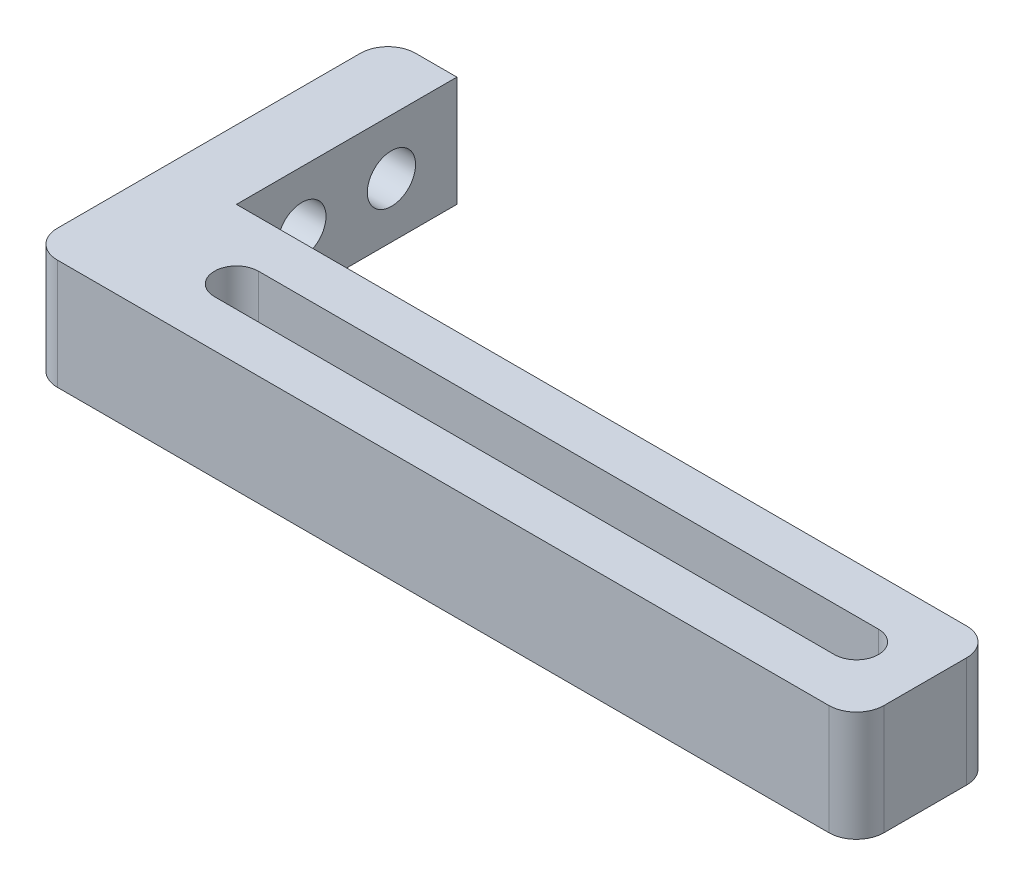
ISO-10303-21;
HEADER;
FILE_DESCRIPTION(('STEP AP214'),'2;1');
FILE_NAME('part.step','',(''),(''),'','','');
FILE_SCHEMA(('AUTOMOTIVE_DESIGN { 1 0 10303 214 1 1 1 1 }'));
ENDSEC;
DATA;
#1=APPLICATION_CONTEXT('core data for automotive mechanical design processes');
#2=APPLICATION_PROTOCOL_DEFINITION('international standard','automotive_design',2000,#1);
#3=PRODUCT_CONTEXT('',#1,'mechanical');
#4=PRODUCT('Part','Part','',(#3));
#5=PRODUCT_RELATED_PRODUCT_CATEGORY('part','',(#4));
#6=PRODUCT_DEFINITION_FORMATION('','',#4);
#7=PRODUCT_DEFINITION_CONTEXT('part definition',#1,'design');
#8=PRODUCT_DEFINITION('design','',#6,#7);
#9=PRODUCT_DEFINITION_SHAPE('','',#8);
#10=(LENGTH_UNIT() NAMED_UNIT(*) SI_UNIT(.MILLI.,.METRE.));
#11=(NAMED_UNIT(*) PLANE_ANGLE_UNIT() SI_UNIT($,.RADIAN.));
#12=(NAMED_UNIT(*) SI_UNIT($,.STERADIAN.) SOLID_ANGLE_UNIT());
#13=UNCERTAINTY_MEASURE_WITH_UNIT(LENGTH_MEASURE(1.E-05),#10,'distance_accuracy_value','');
#14=(GEOMETRIC_REPRESENTATION_CONTEXT(3) GLOBAL_UNCERTAINTY_ASSIGNED_CONTEXT((#13)) GLOBAL_UNIT_ASSIGNED_CONTEXT((#10,
#11,#12)) REPRESENTATION_CONTEXT('',''));
#15=CARTESIAN_POINT('',(0.,0.,0.));
#16=DIRECTION('',(0.,0.,1.));
#17=DIRECTION('',(1.,0.,0.));
#18=AXIS2_PLACEMENT_3D('',#15,#16,#17);
#19=CARTESIAN_POINT('',(10.,0.,-5.));
#20=DIRECTION('',(0.,1.,0.));
#21=DIRECTION('',(0.,0.,1.));
#22=AXIS2_PLACEMENT_3D('',#19,#20,#21);
#23=CYLINDRICAL_SURFACE('',#22,1.6);
#24=CARTESIAN_POINT('',(10.,3.,-5.));
#25=DIRECTION('',(0.,-1.,0.));
#26=DIRECTION('',(0.,0.,-1.));
#27=AXIS2_PLACEMENT_3D('',#24,#25,#26);
#28=CIRCLE('',#27,1.6);
#29=CARTESIAN_POINT('',(10.,3.,-6.6));
#30=VERTEX_POINT('',#29);
#31=CARTESIAN_POINT('',(10.,3.,-3.4));
#32=VERTEX_POINT('',#31);
#33=EDGE_CURVE('E207',#30,#32,#28,.F.);
#34=ORIENTED_EDGE('',*,*,#33,.F.);
#35=DIRECTION('',(0.,1.,0.));
#36=VECTOR('',#35,1.);
#37=CARTESIAN_POINT('',(10.,0.,-6.6));
#38=LINE('',#37,#36);
#39=CARTESIAN_POINT('',(10.,8.,-6.6));
#40=VERTEX_POINT('',#39);
#41=EDGE_CURVE('E222',#30,#40,#38,.T.);
#42=ORIENTED_EDGE('',*,*,#41,.T.);
#43=CARTESIAN_POINT('',(10.,8.,-5.));
#44=DIRECTION('',(0.,1.,0.));
#45=DIRECTION('',(0.,0.,1.));
#46=AXIS2_PLACEMENT_3D('',#43,#44,#45);
#47=CIRCLE('',#46,1.6);
#48=CARTESIAN_POINT('',(10.,8.,-3.4));
#49=VERTEX_POINT('',#48);
#50=EDGE_CURVE('E209',#40,#49,#47,.T.);
#51=ORIENTED_EDGE('',*,*,#50,.T.);
#52=DIRECTION('',(0.,1.,0.));
#53=VECTOR('',#52,1.);
#54=CARTESIAN_POINT('',(10.,0.,-3.4));
#55=LINE('',#54,#53);
#56=EDGE_CURVE('E221',#32,#49,#55,.T.);
#57=ORIENTED_EDGE('',*,*,#56,.F.);
#58=EDGE_LOOP('',(#34,#42,#51,#57));
#59=FACE_BOUND('',#58,.T.);
#60=ADVANCED_FACE('F33',(#59),#23,.F.);
#61=CARTESIAN_POINT('',(10.,0.,-6.6));
#62=DIRECTION('',(0.,0.,-1.));
#63=DIRECTION('',(-1.,0.,0.));
#64=AXIS2_PLACEMENT_3D('',#61,#62,#63);
#65=PLANE('',#64);
#66=DIRECTION('',(-1.,0.,0.));
#67=VECTOR('',#66,1.);
#68=CARTESIAN_POINT('',(10.,3.,-6.6));
#69=LINE('',#68,#67);
#70=CARTESIAN_POINT('',(55.,3.,-6.6));
#71=VERTEX_POINT('',#70);
#72=EDGE_CURVE('E205',#71,#30,#69,.T.);
#73=ORIENTED_EDGE('',*,*,#72,.F.);
#74=DIRECTION('',(0.,1.,0.));
#75=VECTOR('',#74,1.);
#76=CARTESIAN_POINT('',(55.,0.,-6.6));
#77=LINE('',#76,#75);
#78=CARTESIAN_POINT('',(55.,8.,-6.6));
#79=VERTEX_POINT('',#78);
#80=EDGE_CURVE('E225',#71,#79,#77,.T.);
#81=ORIENTED_EDGE('',*,*,#80,.T.);
#82=DIRECTION('',(-1.,0.,0.));
#83=VECTOR('',#82,1.);
#84=CARTESIAN_POINT('',(10.,8.,-6.6));
#85=LINE('',#84,#83);
#86=EDGE_CURVE('E218',#79,#40,#85,.T.);
#87=ORIENTED_EDGE('',*,*,#86,.T.);
#88=ORIENTED_EDGE('',*,*,#41,.F.);
#89=EDGE_LOOP('',(#73,#81,#87,#88));
#90=FACE_BOUND('',#89,.T.);
#91=ADVANCED_FACE('F357',(#90),#65,.F.);
#92=CARTESIAN_POINT('',(55.,0.,-5.));
#93=DIRECTION('',(0.,1.,0.));
#94=DIRECTION('',(0.,0.,1.));
#95=AXIS2_PLACEMENT_3D('',#92,#93,#94);
#96=CYLINDRICAL_SURFACE('',#95,1.6);
#97=CARTESIAN_POINT('',(55.,3.,-5.));
#98=DIRECTION('',(0.,-1.,0.));
#99=DIRECTION('',(0.,0.,-1.));
#100=AXIS2_PLACEMENT_3D('',#97,#98,#99);
#101=CIRCLE('',#100,1.6);
#102=CARTESIAN_POINT('',(55.,3.,-3.4));
#103=VERTEX_POINT('',#102);
#104=EDGE_CURVE('E200',#103,#71,#101,.F.);
#105=ORIENTED_EDGE('',*,*,#104,.F.);
#106=DIRECTION('',(0.,1.,0.));
#107=VECTOR('',#106,1.);
#108=CARTESIAN_POINT('',(55.,0.,-3.4));
#109=LINE('',#108,#107);
#110=CARTESIAN_POINT('',(55.,8.,-3.4));
#111=VERTEX_POINT('',#110);
#112=EDGE_CURVE('E227',#103,#111,#109,.T.);
#113=ORIENTED_EDGE('',*,*,#112,.T.);
#114=CARTESIAN_POINT('',(55.,8.,-5.));
#115=DIRECTION('',(0.,1.,0.));
#116=DIRECTION('',(0.,0.,1.));
#117=AXIS2_PLACEMENT_3D('',#114,#115,#116);
#118=CIRCLE('',#117,1.6);
#119=EDGE_CURVE('E215',#111,#79,#118,.T.);
#120=ORIENTED_EDGE('',*,*,#119,.T.);
#121=ORIENTED_EDGE('',*,*,#80,.F.);
#122=EDGE_LOOP('',(#105,#113,#120,#121));
#123=FACE_BOUND('',#122,.T.);
#124=ADVANCED_FACE('F363',(#123),#96,.F.);
#125=CARTESIAN_POINT('',(10.,0.,-3.4));
#126=DIRECTION('',(0.,0.,1.));
#127=DIRECTION('',(1.,0.,0.));
#128=AXIS2_PLACEMENT_3D('',#125,#126,#127);
#129=PLANE('',#128);
#130=DIRECTION('',(1.,0.,0.));
#131=VECTOR('',#130,1.);
#132=CARTESIAN_POINT('',(10.,3.,-3.4));
#133=LINE('',#132,#131);
#134=EDGE_CURVE('E277',#32,#103,#133,.T.);
#135=ORIENTED_EDGE('',*,*,#134,.F.);
#136=ORIENTED_EDGE('',*,*,#56,.T.);
#137=DIRECTION('',(1.,0.,0.));
#138=VECTOR('',#137,1.);
#139=CARTESIAN_POINT('',(10.,8.,-3.4));
#140=LINE('',#139,#138);
#141=EDGE_CURVE('E212',#49,#111,#140,.T.);
#142=ORIENTED_EDGE('',*,*,#141,.T.);
#143=ORIENTED_EDGE('',*,*,#112,.F.);
#144=EDGE_LOOP('',(#135,#136,#142,#143));
#145=FACE_BOUND('',#144,.T.);
#146=ADVANCED_FACE('F369',(#145),#129,.F.);
#147=CARTESIAN_POINT('',(5.,8.,-26.));
#148=DIRECTION('',(0.,0.,1.));
#149=DIRECTION('',(1.,0.,0.));
#150=AXIS2_PLACEMENT_3D('',#147,#148,#149);
#151=PLANE('',#150);
#152=DIRECTION('',(-1.,0.,0.));
#153=VECTOR('',#152,1.);
#154=CARTESIAN_POINT('',(5.,0.,-26.));
#155=LINE('',#154,#153);
#156=CARTESIAN_POINT('',(5.,0.,-26.));
#157=VERTEX_POINT('',#156);
#158=CARTESIAN_POINT('',(2.,0.,-26.));
#159=VERTEX_POINT('',#158);
#160=EDGE_CURVE('E239',#157,#159,#155,.T.);
#161=ORIENTED_EDGE('',*,*,#160,.T.);
#162=DIRECTION('',(0.,-1.,0.));
#163=VECTOR('',#162,1.);
#164=CARTESIAN_POINT('',(2.,8.,-26.));
#165=LINE('',#164,#163);
#166=CARTESIAN_POINT('',(2.,8.,-26.));
#167=VERTEX_POINT('',#166);
#168=EDGE_CURVE('E292',#159,#167,#165,.F.);
#169=ORIENTED_EDGE('',*,*,#168,.T.);
#170=DIRECTION('',(-1.,0.,0.));
#171=VECTOR('',#170,1.);
#172=CARTESIAN_POINT('',(5.,8.,-26.));
#173=LINE('',#172,#171);
#174=CARTESIAN_POINT('',(5.,8.,-26.));
#175=VERTEX_POINT('',#174);
#176=EDGE_CURVE('E242',#175,#167,#173,.T.);
#177=ORIENTED_EDGE('',*,*,#176,.F.);
#178=DIRECTION('',(0.,-1.,0.));
#179=VECTOR('',#178,1.);
#180=CARTESIAN_POINT('',(5.,8.,-26.));
#181=LINE('',#180,#179);
#182=EDGE_CURVE('E258',#175,#157,#181,.T.);
#183=ORIENTED_EDGE('',*,*,#182,.T.);
#184=EDGE_LOOP('',(#161,#169,#177,#183));
#185=FACE_BOUND('',#184,.T.);
#186=ADVANCED_FACE('F332',(#185),#151,.F.);
#187=CARTESIAN_POINT('',(0.,8.,-26.));
#188=DIRECTION('',(1.,0.,0.));
#189=DIRECTION('',(0.,0.,-1.));
#190=AXIS2_PLACEMENT_3D('',#187,#188,#189);
#191=PLANE('',#190);
#192=CARTESIAN_POINT('',(0.,4.,-14.75));
#193=DIRECTION('',(1.,0.,0.));
#194=DIRECTION('',(0.,0.,-1.));
#195=AXIS2_PLACEMENT_3D('',#192,#193,#194);
#196=CIRCLE('',#195,1.75);
#197=CARTESIAN_POINT('',(0.,4.,-16.5));
#198=VERTEX_POINT('',#197);
#199=EDGE_CURVE('E230',#198,#198,#196,.T.);
#200=ORIENTED_EDGE('',*,*,#199,.T.);
#201=EDGE_LOOP('',(#200));
#202=FACE_BOUND('',#201,.T.);
#203=CARTESIAN_POINT('',(0.,4.,-21.25));
#204=DIRECTION('',(1.,0.,0.));
#205=DIRECTION('',(0.,0.,-1.));
#206=AXIS2_PLACEMENT_3D('',#203,#204,#205);
#207=CIRCLE('',#206,1.75);
#208=CARTESIAN_POINT('',(0.,4.,-23.));
#209=VERTEX_POINT('',#208);
#210=EDGE_CURVE('E236',#209,#209,#207,.T.);
#211=ORIENTED_EDGE('',*,*,#210,.T.);
#212=EDGE_LOOP('',(#211));
#213=FACE_BOUND('',#212,.T.);
#214=DIRECTION('',(0.,0.,1.));
#215=VECTOR('',#214,1.);
#216=CARTESIAN_POINT('',(0.,8.,-26.));
#217=LINE('',#216,#215);
#218=CARTESIAN_POINT('',(0.,8.,-24.));
#219=VERTEX_POINT('',#218);
#220=CARTESIAN_POINT('',(0.,8.,-2.));
#221=VERTEX_POINT('',#220);
#222=EDGE_CURVE('E245',#219,#221,#217,.T.);
#223=ORIENTED_EDGE('',*,*,#222,.F.);
#224=DIRECTION('',(0.,-1.,0.));
#225=VECTOR('',#224,1.);
#226=CARTESIAN_POINT('',(0.,8.,-24.));
#227=LINE('',#226,#225);
#228=CARTESIAN_POINT('',(0.,0.,-24.));
#229=VERTEX_POINT('',#228);
#230=EDGE_CURVE('E281',#219,#229,#227,.T.);
#231=ORIENTED_EDGE('',*,*,#230,.T.);
#232=DIRECTION('',(0.,0.,1.));
#233=VECTOR('',#232,1.);
#234=CARTESIAN_POINT('',(0.,0.,-26.));
#235=LINE('',#234,#233);
#236=CARTESIAN_POINT('',(0.,0.,-2.));
#237=VERTEX_POINT('',#236);
#238=EDGE_CURVE('E261',#229,#237,#235,.T.);
#239=ORIENTED_EDGE('',*,*,#238,.T.);
#240=DIRECTION('',(0.,-1.,0.));
#241=VECTOR('',#240,1.);
#242=CARTESIAN_POINT('',(0.,8.,-2.));
#243=LINE('',#242,#241);
#244=EDGE_CURVE('E279',#237,#221,#243,.F.);
#245=ORIENTED_EDGE('',*,*,#244,.T.);
#246=EDGE_LOOP('',(#223,#231,#239,#245));
#247=FACE_BOUND('',#246,.T.);
#248=ADVANCED_FACE('F340',(#202,#213,#247),#191,.F.);
#249=CARTESIAN_POINT('',(0.,8.,0.));
#250=DIRECTION('',(0.,0.,-1.));
#251=DIRECTION('',(-1.,0.,0.));
#252=AXIS2_PLACEMENT_3D('',#249,#250,#251);
#253=PLANE('',#252);
#254=DIRECTION('',(1.,0.,0.));
#255=VECTOR('',#254,1.);
#256=CARTESIAN_POINT('',(0.,8.,0.));
#257=LINE('',#256,#255);
#258=CARTESIAN_POINT('',(2.,8.,0.));
#259=VERTEX_POINT('',#258);
#260=CARTESIAN_POINT('',(58.,8.,0.));
#261=VERTEX_POINT('',#260);
#262=EDGE_CURVE('E249',#259,#261,#257,.T.);
#263=ORIENTED_EDGE('',*,*,#262,.F.);
#264=DIRECTION('',(0.,-1.,0.));
#265=VECTOR('',#264,1.);
#266=CARTESIAN_POINT('',(2.,8.,0.));
#267=LINE('',#266,#265);
#268=CARTESIAN_POINT('',(2.,0.,0.));
#269=VERTEX_POINT('',#268);
#270=EDGE_CURVE('E303',#259,#269,#267,.T.);
#271=ORIENTED_EDGE('',*,*,#270,.T.);
#272=DIRECTION('',(1.,0.,0.));
#273=VECTOR('',#272,1.);
#274=CARTESIAN_POINT('',(0.,0.,0.));
#275=LINE('',#274,#273);
#276=CARTESIAN_POINT('',(58.,0.,0.));
#277=VERTEX_POINT('',#276);
#278=EDGE_CURVE('E264',#269,#277,#275,.T.);
#279=ORIENTED_EDGE('',*,*,#278,.T.);
#280=DIRECTION('',(0.,-1.,0.));
#281=VECTOR('',#280,1.);
#282=CARTESIAN_POINT('',(58.,8.,0.));
#283=LINE('',#282,#281);
#284=EDGE_CURVE('E301',#277,#261,#283,.F.);
#285=ORIENTED_EDGE('',*,*,#284,.T.);
#286=EDGE_LOOP('',(#263,#271,#279,#285));
#287=FACE_BOUND('',#286,.T.);
#288=ADVANCED_FACE('F347',(#287),#253,.F.);
#289=CARTESIAN_POINT('',(60.,8.,0.));
#290=DIRECTION('',(-1.,0.,0.));
#291=DIRECTION('',(0.,0.,1.));
#292=AXIS2_PLACEMENT_3D('',#289,#290,#291);
#293=PLANE('',#292);
#294=DIRECTION('',(0.,0.,-1.));
#295=VECTOR('',#294,1.);
#296=CARTESIAN_POINT('',(60.,8.,0.));
#297=LINE('',#296,#295);
#298=CARTESIAN_POINT('',(60.,8.,-2.));
#299=VERTEX_POINT('',#298);
#300=CARTESIAN_POINT('',(60.,8.,-8.));
#301=VERTEX_POINT('',#300);
#302=EDGE_CURVE('E252',#299,#301,#297,.T.);
#303=ORIENTED_EDGE('',*,*,#302,.F.);
#304=DIRECTION('',(0.,-1.,0.));
#305=VECTOR('',#304,1.);
#306=CARTESIAN_POINT('',(60.,8.,-2.));
#307=LINE('',#306,#305);
#308=CARTESIAN_POINT('',(60.,0.,-2.));
#309=VERTEX_POINT('',#308);
#310=EDGE_CURVE('E41',#299,#309,#307,.T.);
#311=ORIENTED_EDGE('',*,*,#310,.T.);
#312=DIRECTION('',(0.,0.,-1.));
#313=VECTOR('',#312,1.);
#314=CARTESIAN_POINT('',(60.,0.,0.));
#315=LINE('',#314,#313);
#316=CARTESIAN_POINT('',(60.,0.,-8.));
#317=VERTEX_POINT('',#316);
#318=EDGE_CURVE('E267',#309,#317,#315,.T.);
#319=ORIENTED_EDGE('',*,*,#318,.T.);
#320=DIRECTION('',(0.,-1.,0.));
#321=VECTOR('',#320,1.);
#322=CARTESIAN_POINT('',(60.,8.,-8.));
#323=LINE('',#322,#321);
#324=EDGE_CURVE('E56',#317,#301,#323,.F.);
#325=ORIENTED_EDGE('',*,*,#324,.T.);
#326=EDGE_LOOP('',(#303,#311,#319,#325));
#327=FACE_BOUND('',#326,.T.);
#328=ADVANCED_FACE('F309',(#327),#293,.F.);
#329=CARTESIAN_POINT('',(60.,8.,-10.));
#330=DIRECTION('',(0.,0.,1.));
#331=DIRECTION('',(1.,0.,0.));
#332=AXIS2_PLACEMENT_3D('',#329,#330,#331);
#333=PLANE('',#332);
#334=DIRECTION('',(-1.,0.,0.));
#335=VECTOR('',#334,1.);
#336=CARTESIAN_POINT('',(60.,8.,-10.));
#337=LINE('',#336,#335);
#338=CARTESIAN_POINT('',(58.,8.,-10.));
#339=VERTEX_POINT('',#338);
#340=CARTESIAN_POINT('',(5.,8.,-9.99999999999999));
#341=VERTEX_POINT('',#340);
#342=EDGE_CURVE('E254',#339,#341,#337,.T.);
#343=ORIENTED_EDGE('',*,*,#342,.F.);
#344=DIRECTION('',(0.,-1.,0.));
#345=VECTOR('',#344,1.);
#346=CARTESIAN_POINT('',(58.,8.,-10.));
#347=LINE('',#346,#345);
#348=CARTESIAN_POINT('',(58.,0.,-10.));
#349=VERTEX_POINT('',#348);
#350=EDGE_CURVE('E11',#339,#349,#347,.T.);
#351=ORIENTED_EDGE('',*,*,#350,.T.);
#352=DIRECTION('',(-1.,0.,0.));
#353=VECTOR('',#352,1.);
#354=CARTESIAN_POINT('',(60.,0.,-10.));
#355=LINE('',#354,#353);
#356=CARTESIAN_POINT('',(5.,0.,-9.99999999999999));
#357=VERTEX_POINT('',#356);
#358=EDGE_CURVE('E269',#349,#357,#355,.T.);
#359=ORIENTED_EDGE('',*,*,#358,.T.);
#360=DIRECTION('',(0.,-1.,0.));
#361=VECTOR('',#360,1.);
#362=CARTESIAN_POINT('',(5.,8.,-9.99999999999999));
#363=LINE('',#362,#361);
#364=EDGE_CURVE('E274',#341,#357,#363,.T.);
#365=ORIENTED_EDGE('',*,*,#364,.F.);
#366=EDGE_LOOP('',(#343,#351,#359,#365));
#367=FACE_BOUND('',#366,.T.);
#368=ADVANCED_FACE('F321',(#367),#333,.F.);
#369=CARTESIAN_POINT('',(5.,8.,-9.99999999999999));
#370=DIRECTION('',(-1.,0.,0.));
#371=DIRECTION('',(0.,0.,1.));
#372=AXIS2_PLACEMENT_3D('',#369,#370,#371);
#373=PLANE('',#372);
#374=CARTESIAN_POINT('',(5.,4.,-14.75));
#375=DIRECTION('',(1.,0.,0.));
#376=DIRECTION('',(0.,0.,-1.));
#377=AXIS2_PLACEMENT_3D('',#374,#375,#376);
#378=CIRCLE('',#377,1.75);
#379=CARTESIAN_POINT('',(5.,4.,-16.5));
#380=VERTEX_POINT('',#379);
#381=EDGE_CURVE('E224',#380,#380,#378,.T.);
#382=ORIENTED_EDGE('',*,*,#381,.F.);
#383=EDGE_LOOP('',(#382));
#384=FACE_BOUND('',#383,.T.);
#385=CARTESIAN_POINT('',(5.00000000000001,4.,-21.25));
#386=DIRECTION('',(1.,0.,0.));
#387=DIRECTION('',(0.,0.,-1.));
#388=AXIS2_PLACEMENT_3D('',#385,#386,#387);
#389=CIRCLE('',#388,1.75);
#390=CARTESIAN_POINT('',(5.00000000000001,4.,-23.));
#391=VERTEX_POINT('',#390);
#392=EDGE_CURVE('E233',#391,#391,#389,.T.);
#393=ORIENTED_EDGE('',*,*,#392,.F.);
#394=EDGE_LOOP('',(#393));
#395=FACE_BOUND('',#394,.T.);
#396=DIRECTION('',(0.,0.,-1.));
#397=VECTOR('',#396,1.);
#398=CARTESIAN_POINT('',(5.,0.,-9.99999999999999));
#399=LINE('',#398,#397);
#400=EDGE_CURVE('E246',#357,#157,#399,.T.);
#401=ORIENTED_EDGE('',*,*,#400,.T.);
#402=ORIENTED_EDGE('',*,*,#182,.F.);
#403=DIRECTION('',(0.,0.,-1.));
#404=VECTOR('',#403,1.);
#405=CARTESIAN_POINT('',(5.,8.,-9.99999999999999));
#406=LINE('',#405,#404);
#407=EDGE_CURVE('E256',#341,#175,#406,.T.);
#408=ORIENTED_EDGE('',*,*,#407,.F.);
#409=ORIENTED_EDGE('',*,*,#364,.T.);
#410=EDGE_LOOP('',(#401,#402,#408,#409));
#411=FACE_BOUND('',#410,.T.);
#412=ADVANCED_FACE('F329',(#384,#395,#411),#373,.F.);
#413=CARTESIAN_POINT('',(0.,8.,0.));
#414=DIRECTION('',(0.,1.,0.));
#415=DIRECTION('',(0.,0.,1.));
#416=AXIS2_PLACEMENT_3D('',#413,#414,#415);
#417=PLANE('',#416);
#418=ORIENTED_EDGE('',*,*,#50,.F.);
#419=ORIENTED_EDGE('',*,*,#86,.F.);
#420=ORIENTED_EDGE('',*,*,#119,.F.);
#421=ORIENTED_EDGE('',*,*,#141,.F.);
#422=EDGE_LOOP('',(#418,#419,#420,#421));
#423=FACE_BOUND('',#422,.T.);
#424=ORIENTED_EDGE('',*,*,#176,.T.);
#425=CARTESIAN_POINT('',(2.,8.,-24.));
#426=DIRECTION('',(0.,1.,0.));
#427=DIRECTION('',(0.,0.,1.));
#428=AXIS2_PLACEMENT_3D('',#425,#426,#427);
#429=CIRCLE('',#428,2.);
#430=EDGE_CURVE('E299',#167,#219,#429,.T.);
#431=ORIENTED_EDGE('',*,*,#430,.T.);
#432=ORIENTED_EDGE('',*,*,#222,.T.);
#433=CARTESIAN_POINT('',(2.,8.,-2.));
#434=DIRECTION('',(0.,1.,0.));
#435=DIRECTION('',(0.,0.,1.));
#436=AXIS2_PLACEMENT_3D('',#433,#434,#435);
#437=CIRCLE('',#436,2.);
#438=EDGE_CURVE('E297',#221,#259,#437,.T.);
#439=ORIENTED_EDGE('',*,*,#438,.T.);
#440=ORIENTED_EDGE('',*,*,#262,.T.);
#441=CARTESIAN_POINT('',(58.,8.,-2.));
#442=DIRECTION('',(0.,1.,0.));
#443=DIRECTION('',(0.,0.,1.));
#444=AXIS2_PLACEMENT_3D('',#441,#442,#443);
#445=CIRCLE('',#444,2.);
#446=EDGE_CURVE('E295',#261,#299,#445,.T.);
#447=ORIENTED_EDGE('',*,*,#446,.T.);
#448=ORIENTED_EDGE('',*,*,#302,.T.);
#449=CARTESIAN_POINT('',(58.,8.,-8.));
#450=DIRECTION('',(0.,1.,0.));
#451=DIRECTION('',(0.,0.,1.));
#452=AXIS2_PLACEMENT_3D('',#449,#450,#451);
#453=CIRCLE('',#452,2.);
#454=EDGE_CURVE('E48',#301,#339,#453,.T.);
#455=ORIENTED_EDGE('',*,*,#454,.T.);
#456=ORIENTED_EDGE('',*,*,#342,.T.);
#457=ORIENTED_EDGE('',*,*,#407,.T.);
#458=EDGE_LOOP('',(#424,#431,#432,#439,#440,#447,#448,#455,#456,#457));
#459=FACE_BOUND('',#458,.T.);
#460=ADVANCED_FACE('F324',(#423,#459),#417,.T.);
#461=CARTESIAN_POINT('',(0.,0.,0.));
#462=DIRECTION('',(0.,1.,0.));
#463=DIRECTION('',(0.,0.,1.));
#464=AXIS2_PLACEMENT_3D('',#461,#462,#463);
#465=PLANE('',#464);
#466=DIRECTION('',(-1.,0.,0.));
#467=VECTOR('',#466,1.);
#468=CARTESIAN_POINT('',(55.,0.,-2.15));
#469=LINE('',#468,#467);
#470=CARTESIAN_POINT('',(55.,0.,-2.15));
#471=VERTEX_POINT('',#470);
#472=CARTESIAN_POINT('',(10.,0.,-2.15));
#473=VERTEX_POINT('',#472);
#474=EDGE_CURVE('E194',#471,#473,#469,.T.);
#475=ORIENTED_EDGE('',*,*,#474,.F.);
#476=CARTESIAN_POINT('',(55.,0.,-5.));
#477=DIRECTION('',(0.,-1.,0.));
#478=DIRECTION('',(0.,0.,-1.));
#479=AXIS2_PLACEMENT_3D('',#476,#477,#478);
#480=CIRCLE('',#479,2.85);
#481=CARTESIAN_POINT('',(55.,0.,-7.85));
#482=VERTEX_POINT('',#481);
#483=EDGE_CURVE('E167',#482,#471,#480,.T.);
#484=ORIENTED_EDGE('',*,*,#483,.F.);
#485=DIRECTION('',(1.,0.,0.));
#486=VECTOR('',#485,1.);
#487=CARTESIAN_POINT('',(55.,0.,-7.85));
#488=LINE('',#487,#486);
#489=CARTESIAN_POINT('',(10.,0.,-7.85000000000001));
#490=VERTEX_POINT('',#489);
#491=EDGE_CURVE('E185',#490,#482,#488,.T.);
#492=ORIENTED_EDGE('',*,*,#491,.F.);
#493=CARTESIAN_POINT('',(10.,0.,-5.));
#494=DIRECTION('',(0.,-1.,0.));
#495=DIRECTION('',(0.,0.,-1.));
#496=AXIS2_PLACEMENT_3D('',#493,#494,#495);
#497=CIRCLE('',#496,2.85);
#498=EDGE_CURVE('E188',#473,#490,#497,.T.);
#499=ORIENTED_EDGE('',*,*,#498,.F.);
#500=EDGE_LOOP('',(#475,#484,#492,#499));
#501=FACE_BOUND('',#500,.T.);
#502=ORIENTED_EDGE('',*,*,#238,.F.);
#503=CARTESIAN_POINT('',(2.,0.,-24.));
#504=DIRECTION('',(0.,1.,0.));
#505=DIRECTION('',(0.,0.,1.));
#506=AXIS2_PLACEMENT_3D('',#503,#504,#505);
#507=CIRCLE('',#506,2.);
#508=EDGE_CURVE('E290',#229,#159,#507,.F.);
#509=ORIENTED_EDGE('',*,*,#508,.T.);
#510=ORIENTED_EDGE('',*,*,#160,.F.);
#511=ORIENTED_EDGE('',*,*,#400,.F.);
#512=ORIENTED_EDGE('',*,*,#358,.F.);
#513=CARTESIAN_POINT('',(58.,0.,-8.));
#514=DIRECTION('',(0.,1.,0.));
#515=DIRECTION('',(0.,0.,1.));
#516=AXIS2_PLACEMENT_3D('',#513,#514,#515);
#517=CIRCLE('',#516,2.);
#518=EDGE_CURVE('E284',#349,#317,#517,.F.);
#519=ORIENTED_EDGE('',*,*,#518,.T.);
#520=ORIENTED_EDGE('',*,*,#318,.F.);
#521=CARTESIAN_POINT('',(58.,0.,-2.));
#522=DIRECTION('',(0.,1.,0.));
#523=DIRECTION('',(0.,0.,1.));
#524=AXIS2_PLACEMENT_3D('',#521,#522,#523);
#525=CIRCLE('',#524,2.);
#526=EDGE_CURVE('E286',#309,#277,#525,.F.);
#527=ORIENTED_EDGE('',*,*,#526,.T.);
#528=ORIENTED_EDGE('',*,*,#278,.F.);
#529=CARTESIAN_POINT('',(2.,0.,-2.));
#530=DIRECTION('',(0.,1.,0.));
#531=DIRECTION('',(0.,0.,1.));
#532=AXIS2_PLACEMENT_3D('',#529,#530,#531);
#533=CIRCLE('',#532,2.);
#534=EDGE_CURVE('E288',#269,#237,#533,.F.);
#535=ORIENTED_EDGE('',*,*,#534,.T.);
#536=EDGE_LOOP('',(#502,#509,#510,#511,#512,#519,#520,#527,#528,#535));
#537=FACE_BOUND('',#536,.T.);
#538=ADVANCED_FACE('F314',(#501,#537),#465,.F.);
#539=CARTESIAN_POINT('',(0.,4.,-21.25));
#540=DIRECTION('',(1.,0.,0.));
#541=DIRECTION('',(0.,0.,-1.));
#542=AXIS2_PLACEMENT_3D('',#539,#540,#541);
#543=CYLINDRICAL_SURFACE('',#542,1.75);
#544=ORIENTED_EDGE('',*,*,#210,.F.);
#545=EDGE_LOOP('',(#544));
#546=FACE_BOUND('',#545,.T.);
#547=ORIENTED_EDGE('',*,*,#392,.T.);
#548=EDGE_LOOP('',(#547));
#549=FACE_BOUND('',#548,.T.);
#550=ADVANCED_FACE('F374',(#546,#549),#543,.F.);
#551=CARTESIAN_POINT('',(0.,4.,-14.75));
#552=DIRECTION('',(1.,0.,0.));
#553=DIRECTION('',(0.,0.,-1.));
#554=AXIS2_PLACEMENT_3D('',#551,#552,#553);
#555=CYLINDRICAL_SURFACE('',#554,1.75);
#556=ORIENTED_EDGE('',*,*,#199,.F.);
#557=EDGE_LOOP('',(#556));
#558=FACE_BOUND('',#557,.T.);
#559=ORIENTED_EDGE('',*,*,#381,.T.);
#560=EDGE_LOOP('',(#559));
#561=FACE_BOUND('',#560,.T.);
#562=ADVANCED_FACE('F371',(#558,#561),#555,.F.);
#563=CARTESIAN_POINT('',(55.,3.,-5.));
#564=DIRECTION('',(0.,-1.,0.));
#565=DIRECTION('',(0.,0.,-1.));
#566=AXIS2_PLACEMENT_3D('',#563,#564,#565);
#567=PLANE('',#566);
#568=CARTESIAN_POINT('',(55.,3.,-5.));
#569=DIRECTION('',(0.,-1.,0.));
#570=DIRECTION('',(0.,0.,-1.));
#571=AXIS2_PLACEMENT_3D('',#568,#569,#570);
#572=CIRCLE('',#571,2.85);
#573=CARTESIAN_POINT('',(55.,3.,-7.85));
#574=VERTEX_POINT('',#573);
#575=CARTESIAN_POINT('',(55.,3.,-2.15));
#576=VERTEX_POINT('',#575);
#577=EDGE_CURVE('E164',#574,#576,#572,.T.);
#578=ORIENTED_EDGE('',*,*,#577,.T.);
#579=DIRECTION('',(-1.,0.,0.));
#580=VECTOR('',#579,1.);
#581=CARTESIAN_POINT('',(55.,3.,-2.15));
#582=LINE('',#581,#580);
#583=CARTESIAN_POINT('',(10.,3.,-2.15));
#584=VERTEX_POINT('',#583);
#585=EDGE_CURVE('E175',#576,#584,#582,.T.);
#586=ORIENTED_EDGE('',*,*,#585,.T.);
#587=CARTESIAN_POINT('',(10.,3.,-5.));
#588=DIRECTION('',(0.,-1.,0.));
#589=DIRECTION('',(0.,0.,-1.));
#590=AXIS2_PLACEMENT_3D('',#587,#588,#589);
#591=CIRCLE('',#590,2.85);
#592=CARTESIAN_POINT('',(10.,3.,-7.85000000000001));
#593=VERTEX_POINT('',#592);
#594=EDGE_CURVE('E180',#584,#593,#591,.T.);
#595=ORIENTED_EDGE('',*,*,#594,.T.);
#596=DIRECTION('',(1.,0.,0.));
#597=VECTOR('',#596,1.);
#598=CARTESIAN_POINT('',(55.,3.,-7.85));
#599=LINE('',#598,#597);
#600=EDGE_CURVE('E172',#593,#574,#599,.T.);
#601=ORIENTED_EDGE('',*,*,#600,.T.);
#602=EDGE_LOOP('',(#578,#586,#595,#601));
#603=FACE_BOUND('',#602,.T.);
#604=ORIENTED_EDGE('',*,*,#33,.T.);
#605=ORIENTED_EDGE('',*,*,#134,.T.);
#606=ORIENTED_EDGE('',*,*,#104,.T.);
#607=ORIENTED_EDGE('',*,*,#72,.T.);
#608=EDGE_LOOP('',(#604,#605,#606,#607));
#609=FACE_BOUND('',#608,.T.);
#610=ADVANCED_FACE('F182',(#603,#609),#567,.T.);
#611=CARTESIAN_POINT('',(55.,3.,-5.));
#612=DIRECTION('',(0.,-1.,0.));
#613=DIRECTION('',(0.,0.,-1.));
#614=AXIS2_PLACEMENT_3D('',#611,#612,#613);
#615=CYLINDRICAL_SURFACE('',#614,2.85);
#616=ORIENTED_EDGE('',*,*,#483,.T.);
#617=DIRECTION('',(0.,-1.,0.));
#618=VECTOR('',#617,1.);
#619=CARTESIAN_POINT('',(55.,3.,-2.15));
#620=LINE('',#619,#618);
#621=EDGE_CURVE('E160',#576,#471,#620,.T.);
#622=ORIENTED_EDGE('',*,*,#621,.F.);
#623=ORIENTED_EDGE('',*,*,#577,.F.);
#624=DIRECTION('',(0.,-1.,0.));
#625=VECTOR('',#624,1.);
#626=CARTESIAN_POINT('',(55.,3.,-7.85));
#627=LINE('',#626,#625);
#628=EDGE_CURVE('E198',#574,#482,#627,.T.);
#629=ORIENTED_EDGE('',*,*,#628,.T.);
#630=EDGE_LOOP('',(#616,#622,#623,#629));
#631=FACE_BOUND('',#630,.T.);
#632=ADVANCED_FACE('F162',(#631),#615,.F.);
#633=CARTESIAN_POINT('',(55.,3.,-7.85));
#634=DIRECTION('',(0.,0.,-1.));
#635=DIRECTION('',(-1.,0.,0.));
#636=AXIS2_PLACEMENT_3D('',#633,#634,#635);
#637=PLANE('',#636);
#638=ORIENTED_EDGE('',*,*,#491,.T.);
#639=ORIENTED_EDGE('',*,*,#628,.F.);
#640=ORIENTED_EDGE('',*,*,#600,.F.);
#641=DIRECTION('',(0.,-1.,0.));
#642=VECTOR('',#641,1.);
#643=CARTESIAN_POINT('',(10.,3.,-7.85000000000001));
#644=LINE('',#643,#642);
#645=EDGE_CURVE('E201',#593,#490,#644,.T.);
#646=ORIENTED_EDGE('',*,*,#645,.T.);
#647=EDGE_LOOP('',(#638,#639,#640,#646));
#648=FACE_BOUND('',#647,.T.);
#649=ADVANCED_FACE('F408',(#648),#637,.F.);
#650=CARTESIAN_POINT('',(10.,3.,-5.));
#651=DIRECTION('',(0.,-1.,0.));
#652=DIRECTION('',(0.,0.,-1.));
#653=AXIS2_PLACEMENT_3D('',#650,#651,#652);
#654=CYLINDRICAL_SURFACE('',#653,2.85);
#655=ORIENTED_EDGE('',*,*,#498,.T.);
#656=ORIENTED_EDGE('',*,*,#645,.F.);
#657=ORIENTED_EDGE('',*,*,#594,.F.);
#658=DIRECTION('',(0.,-1.,0.));
#659=VECTOR('',#658,1.);
#660=CARTESIAN_POINT('',(10.,3.,-2.15));
#661=LINE('',#660,#659);
#662=EDGE_CURVE('E171',#584,#473,#661,.T.);
#663=ORIENTED_EDGE('',*,*,#662,.T.);
#664=EDGE_LOOP('',(#655,#656,#657,#663));
#665=FACE_BOUND('',#664,.T.);
#666=ADVANCED_FACE('F403',(#665),#654,.F.);
#667=CARTESIAN_POINT('',(55.,3.,-2.15));
#668=DIRECTION('',(0.,0.,1.));
#669=DIRECTION('',(1.,0.,0.));
#670=AXIS2_PLACEMENT_3D('',#667,#668,#669);
#671=PLANE('',#670);
#672=ORIENTED_EDGE('',*,*,#474,.T.);
#673=ORIENTED_EDGE('',*,*,#662,.F.);
#674=ORIENTED_EDGE('',*,*,#585,.F.);
#675=ORIENTED_EDGE('',*,*,#621,.T.);
#676=EDGE_LOOP('',(#672,#673,#674,#675));
#677=FACE_BOUND('',#676,.T.);
#678=ADVANCED_FACE('F176',(#677),#671,.F.);
#679=CARTESIAN_POINT('',(2.,8.,-24.));
#680=DIRECTION('',(0.,-1.,0.));
#681=DIRECTION('',(0.,0.,-1.));
#682=AXIS2_PLACEMENT_3D('',#679,#680,#681);
#683=CYLINDRICAL_SURFACE('',#682,2.);
#684=ORIENTED_EDGE('',*,*,#430,.F.);
#685=ORIENTED_EDGE('',*,*,#168,.F.);
#686=ORIENTED_EDGE('',*,*,#508,.F.);
#687=ORIENTED_EDGE('',*,*,#230,.F.);
#688=EDGE_LOOP('',(#684,#685,#686,#687));
#689=FACE_BOUND('',#688,.T.);
#690=ADVANCED_FACE('F335',(#689),#683,.T.);
#691=CARTESIAN_POINT('',(2.,8.,-2.));
#692=DIRECTION('',(0.,-1.,0.));
#693=DIRECTION('',(0.,0.,-1.));
#694=AXIS2_PLACEMENT_3D('',#691,#692,#693);
#695=CYLINDRICAL_SURFACE('',#694,2.);
#696=ORIENTED_EDGE('',*,*,#438,.F.);
#697=ORIENTED_EDGE('',*,*,#244,.F.);
#698=ORIENTED_EDGE('',*,*,#534,.F.);
#699=ORIENTED_EDGE('',*,*,#270,.F.);
#700=EDGE_LOOP('',(#696,#697,#698,#699));
#701=FACE_BOUND('',#700,.T.);
#702=ADVANCED_FACE('F343',(#701),#695,.T.);
#703=CARTESIAN_POINT('',(58.,8.,-2.));
#704=DIRECTION('',(0.,-1.,0.));
#705=DIRECTION('',(0.,0.,-1.));
#706=AXIS2_PLACEMENT_3D('',#703,#704,#705);
#707=CYLINDRICAL_SURFACE('',#706,2.);
#708=ORIENTED_EDGE('',*,*,#446,.F.);
#709=ORIENTED_EDGE('',*,*,#284,.F.);
#710=ORIENTED_EDGE('',*,*,#526,.F.);
#711=ORIENTED_EDGE('',*,*,#310,.F.);
#712=EDGE_LOOP('',(#708,#709,#710,#711));
#713=FACE_BOUND('',#712,.T.);
#714=ADVANCED_FACE('F349',(#713),#707,.T.);
#715=CARTESIAN_POINT('',(58.,8.,-8.));
#716=DIRECTION('',(0.,-1.,0.));
#717=DIRECTION('',(0.,0.,-1.));
#718=AXIS2_PLACEMENT_3D('',#715,#716,#717);
#719=CYLINDRICAL_SURFACE('',#718,2.);
#720=ORIENTED_EDGE('',*,*,#454,.F.);
#721=ORIENTED_EDGE('',*,*,#324,.F.);
#722=ORIENTED_EDGE('',*,*,#518,.F.);
#723=ORIENTED_EDGE('',*,*,#350,.F.);
#724=EDGE_LOOP('',(#720,#721,#722,#723));
#725=FACE_BOUND('',#724,.T.);
#726=ADVANCED_FACE('F35',(#725),#719,.T.);
#727=CLOSED_SHELL('',(#60,#91,#124,#146,#186,#248,#288,#328,#368,#412,#460,#538,#550,#562,#610,
#632,#649,#666,#678,#690,#702,#714,#726));
#728=MANIFOLD_SOLID_BREP('B2',#727);
#729=ADVANCED_BREP_SHAPE_REPRESENTATION('',(#18,#728),#14);
#730=SHAPE_DEFINITION_REPRESENTATION(#9,#729);
ENDSEC;
END-ISO-10303-21;
